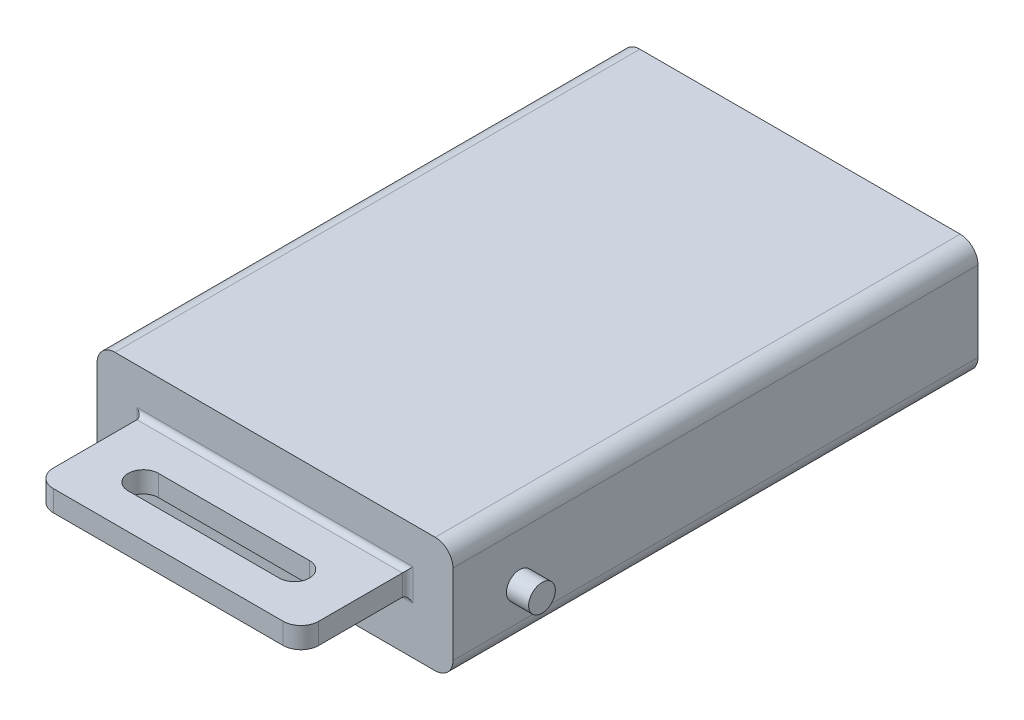
ISO-10303-21;
HEADER;
FILE_DESCRIPTION(('STEP AP214'),'2;1');
FILE_NAME('part.step','',(''),(''),'','','');
FILE_SCHEMA(('AUTOMOTIVE_DESIGN { 1 0 10303 214 1 1 1 1 }'));
ENDSEC;
DATA;
#1=APPLICATION_CONTEXT('core data for automotive mechanical design processes');
#2=APPLICATION_PROTOCOL_DEFINITION('international standard','automotive_design',2000,#1);
#3=PRODUCT_CONTEXT('',#1,'mechanical');
#4=PRODUCT('Part','Part','',(#3));
#5=PRODUCT_RELATED_PRODUCT_CATEGORY('part','',(#4));
#6=PRODUCT_DEFINITION_FORMATION('','',#4);
#7=PRODUCT_DEFINITION_CONTEXT('part definition',#1,'design');
#8=PRODUCT_DEFINITION('design','',#6,#7);
#9=PRODUCT_DEFINITION_SHAPE('','',#8);
#10=(LENGTH_UNIT() NAMED_UNIT(*) SI_UNIT(.MILLI.,.METRE.));
#11=(NAMED_UNIT(*) PLANE_ANGLE_UNIT() SI_UNIT($,.RADIAN.));
#12=(NAMED_UNIT(*) SI_UNIT($,.STERADIAN.) SOLID_ANGLE_UNIT());
#13=UNCERTAINTY_MEASURE_WITH_UNIT(LENGTH_MEASURE(1.E-05),#10,'distance_accuracy_value','');
#14=(GEOMETRIC_REPRESENTATION_CONTEXT(3) GLOBAL_UNCERTAINTY_ASSIGNED_CONTEXT((#13)) GLOBAL_UNIT_ASSIGNED_CONTEXT((#10,
#11,#12)) REPRESENTATION_CONTEXT('',''));
#15=CARTESIAN_POINT('',(0.,0.,0.));
#16=DIRECTION('',(0.,0.,1.));
#17=DIRECTION('',(1.,0.,0.));
#18=AXIS2_PLACEMENT_3D('',#15,#16,#17);
#19=CARTESIAN_POINT('',(2.53999999999999,13.97,0.));
#20=DIRECTION('',(0.,0.,1.));
#21=DIRECTION('',(1.,0.,0.));
#22=AXIS2_PLACEMENT_3D('',#19,#20,#21);
#23=PLANE('',#22);
#24=DIRECTION('',(1.,0.,0.));
#25=VECTOR('',#24,1.);
#26=CARTESIAN_POINT('',(2.53999999999999,6.75470203532326,0.));
#27=LINE('',#26,#25);
#28=CARTESIAN_POINT('',(45.1021824015215,6.75470203532326,0.));
#29=VERTEX_POINT('',#28);
#30=CARTESIAN_POINT('',(5.69781759847853,6.75470203532326,0.));
#31=VERTEX_POINT('',#30);
#32=EDGE_CURVE('E369',#29,#31,#27,.F.);
#33=ORIENTED_EDGE('',*,*,#32,.T.);
#34=DIRECTION('',(0.,-1.,0.));
#35=VECTOR('',#34,1.);
#36=CARTESIAN_POINT('',(5.69781759847853,13.97,0.));
#37=LINE('',#36,#35);
#38=CARTESIAN_POINT('',(5.69781759847853,11.2792979646767,0.));
#39=VERTEX_POINT('',#38);
#40=EDGE_CURVE('E371',#31,#39,#37,.F.);
#41=ORIENTED_EDGE('',*,*,#40,.T.);
#42=DIRECTION('',(-1.,0.,0.));
#43=VECTOR('',#42,1.);
#44=CARTESIAN_POINT('',(2.53999999999999,11.2792979646767,0.));
#45=LINE('',#44,#43);
#46=CARTESIAN_POINT('',(45.1021824015215,11.2792979646767,0.));
#47=VERTEX_POINT('',#46);
#48=EDGE_CURVE('E365',#39,#47,#45,.F.);
#49=ORIENTED_EDGE('',*,*,#48,.T.);
#50=DIRECTION('',(0.,1.,0.));
#51=VECTOR('',#50,1.);
#52=CARTESIAN_POINT('',(45.1021824015215,13.97,0.));
#53=LINE('',#52,#51);
#54=EDGE_CURVE('E367',#47,#29,#53,.F.);
#55=ORIENTED_EDGE('',*,*,#54,.T.);
#56=EDGE_LOOP('',(#33,#41,#49,#55));
#57=FACE_BOUND('',#56,.T.);
#58=CARTESIAN_POINT('',(2.53999999999999,13.97,0.));
#59=DIRECTION('',(0.,0.,1.));
#60=DIRECTION('',(1.,0.,0.));
#61=AXIS2_PLACEMENT_3D('',#58,#59,#60);
#62=CIRCLE('',#61,2.54);
#63=CARTESIAN_POINT('',(2.54000000000001,16.51,0.));
#64=VERTEX_POINT('',#63);
#65=CARTESIAN_POINT('',(0.,13.97,0.));
#66=VERTEX_POINT('',#65);
#67=EDGE_CURVE('E277',#64,#66,#62,.T.);
#68=ORIENTED_EDGE('',*,*,#67,.T.);
#69=DIRECTION('',(0.,-1.,0.));
#70=VECTOR('',#69,1.);
#71=CARTESIAN_POINT('',(0.,2.54000000000002,0.));
#72=LINE('',#71,#70);
#73=CARTESIAN_POINT('',(0.,2.54000000000002,0.));
#74=VERTEX_POINT('',#73);
#75=EDGE_CURVE('E306',#66,#74,#72,.T.);
#76=ORIENTED_EDGE('',*,*,#75,.T.);
#77=CARTESIAN_POINT('',(2.54,2.54,0.));
#78=DIRECTION('',(0.,0.,1.));
#79=DIRECTION('',(1.,0.,0.));
#80=AXIS2_PLACEMENT_3D('',#77,#78,#79);
#81=CIRCLE('',#80,2.54);
#82=CARTESIAN_POINT('',(2.54000000000002,0.,0.));
#83=VERTEX_POINT('',#82);
#84=EDGE_CURVE('E309',#74,#83,#81,.T.);
#85=ORIENTED_EDGE('',*,*,#84,.T.);
#86=DIRECTION('',(1.,0.,0.));
#87=VECTOR('',#86,1.);
#88=CARTESIAN_POINT('',(2.54000000000002,0.,0.));
#89=LINE('',#88,#87);
#90=CARTESIAN_POINT('',(48.26,0.,0.));
#91=VERTEX_POINT('',#90);
#92=EDGE_CURVE('E312',#83,#91,#89,.T.);
#93=ORIENTED_EDGE('',*,*,#92,.T.);
#94=CARTESIAN_POINT('',(48.26,2.54,0.));
#95=DIRECTION('',(0.,0.,1.));
#96=DIRECTION('',(-1.,0.,0.));
#97=AXIS2_PLACEMENT_3D('',#94,#95,#96);
#98=CIRCLE('',#97,2.54);
#99=CARTESIAN_POINT('',(50.8,2.54000000000002,0.));
#100=VERTEX_POINT('',#99);
#101=EDGE_CURVE('E315',#91,#100,#98,.T.);
#102=ORIENTED_EDGE('',*,*,#101,.T.);
#103=DIRECTION('',(0.,1.,0.));
#104=VECTOR('',#103,1.);
#105=CARTESIAN_POINT('',(50.8,2.54000000000002,0.));
#106=LINE('',#105,#104);
#107=CARTESIAN_POINT('',(50.8,13.97,0.));
#108=VERTEX_POINT('',#107);
#109=EDGE_CURVE('E318',#100,#108,#106,.T.);
#110=ORIENTED_EDGE('',*,*,#109,.T.);
#111=CARTESIAN_POINT('',(48.26,13.97,0.));
#112=DIRECTION('',(0.,0.,1.));
#113=DIRECTION('',(1.,0.,0.));
#114=AXIS2_PLACEMENT_3D('',#111,#112,#113);
#115=CIRCLE('',#114,2.54);
#116=CARTESIAN_POINT('',(48.26,16.51,0.));
#117=VERTEX_POINT('',#116);
#118=EDGE_CURVE('E321',#108,#117,#115,.T.);
#119=ORIENTED_EDGE('',*,*,#118,.T.);
#120=DIRECTION('',(-1.,0.,0.));
#121=VECTOR('',#120,1.);
#122=CARTESIAN_POINT('',(2.54000000000001,16.51,0.));
#123=LINE('',#122,#121);
#124=EDGE_CURVE('E282',#117,#64,#123,.T.);
#125=ORIENTED_EDGE('',*,*,#124,.T.);
#126=EDGE_LOOP('',(#68,#76,#85,#93,#102,#110,#119,#125));
#127=FACE_BOUND('',#126,.T.);
#128=ADVANCED_FACE('F30',(#57,#127),#23,.T.);
#129=CARTESIAN_POINT('',(50.8,2.54000000000002,-74.93));
#130=DIRECTION('',(1.,0.,0.));
#131=DIRECTION('',(0.,1.,0.));
#132=AXIS2_PLACEMENT_3D('',#129,#130,#131);
#133=PLANE('',#132);
#134=ORIENTED_EDGE('',*,*,#109,.F.);
#135=DIRECTION('',(0.,0.,1.));
#136=VECTOR('',#135,1.);
#137=CARTESIAN_POINT('',(50.8,2.54000000000002,-74.93));
#138=LINE('',#137,#136);
#139=CARTESIAN_POINT('',(50.8,2.54000000000002,-74.93));
#140=VERTEX_POINT('',#139);
#141=EDGE_CURVE('E333',#140,#100,#138,.T.);
#142=ORIENTED_EDGE('',*,*,#141,.F.);
#143=DIRECTION('',(0.,1.,0.));
#144=VECTOR('',#143,1.);
#145=CARTESIAN_POINT('',(50.8,2.54000000000002,-74.93));
#146=LINE('',#145,#144);
#147=CARTESIAN_POINT('',(50.8,13.97,-74.93));
#148=VERTEX_POINT('',#147);
#149=EDGE_CURVE('E294',#140,#148,#146,.T.);
#150=ORIENTED_EDGE('',*,*,#149,.T.);
#151=DIRECTION('',(0.,0.,1.));
#152=VECTOR('',#151,1.);
#153=CARTESIAN_POINT('',(50.8,13.97,-74.93));
#154=LINE('',#153,#152);
#155=EDGE_CURVE('E331',#148,#108,#154,.T.);
#156=ORIENTED_EDGE('',*,*,#155,.T.);
#157=EDGE_LOOP('',(#134,#142,#150,#156));
#158=FACE_BOUND('',#157,.T.);
#159=CARTESIAN_POINT('',(50.8,7.112,-9.525));
#160=DIRECTION('',(1.,0.,0.));
#161=DIRECTION('',(0.,0.,-1.));
#162=AXIS2_PLACEMENT_3D('',#159,#160,#161);
#163=CIRCLE('',#162,1.905);
#164=CARTESIAN_POINT('',(50.8,7.112,-11.43));
#165=VERTEX_POINT('',#164);
#166=EDGE_CURVE('E268',#165,#165,#163,.T.);
#167=ORIENTED_EDGE('',*,*,#166,.F.);
#168=EDGE_LOOP('',(#167));
#169=FACE_BOUND('',#168,.T.);
#170=ADVANCED_FACE('F427',(#158,#169),#133,.T.);
#171=CARTESIAN_POINT('',(2.53999999999999,13.97,-74.93));
#172=DIRECTION('',(0.,0.,1.));
#173=DIRECTION('',(1.,0.,0.));
#174=AXIS2_PLACEMENT_3D('',#171,#172,#173);
#175=CYLINDRICAL_SURFACE('',#174,2.54);
#176=ORIENTED_EDGE('',*,*,#67,.F.);
#177=DIRECTION('',(0.,0.,1.));
#178=VECTOR('',#177,1.);
#179=CARTESIAN_POINT('',(2.54000000000001,16.51,-74.93));
#180=LINE('',#179,#178);
#181=CARTESIAN_POINT('',(2.54000000000001,16.51,-74.93));
#182=VERTEX_POINT('',#181);
#183=EDGE_CURVE('E326',#182,#64,#180,.T.);
#184=ORIENTED_EDGE('',*,*,#183,.F.);
#185=CARTESIAN_POINT('',(2.53999999999999,13.97,-74.93));
#186=DIRECTION('',(0.,0.,1.));
#187=DIRECTION('',(1.,0.,0.));
#188=AXIS2_PLACEMENT_3D('',#185,#186,#187);
#189=CIRCLE('',#188,2.54);
#190=CARTESIAN_POINT('',(0.,13.97,-74.93));
#191=VERTEX_POINT('',#190);
#192=EDGE_CURVE('E278',#182,#191,#189,.T.);
#193=ORIENTED_EDGE('',*,*,#192,.T.);
#194=DIRECTION('',(0.,0.,1.));
#195=VECTOR('',#194,1.);
#196=CARTESIAN_POINT('',(0.,13.97,-74.93));
#197=LINE('',#196,#195);
#198=EDGE_CURVE('E303',#191,#66,#197,.T.);
#199=ORIENTED_EDGE('',*,*,#198,.T.);
#200=EDGE_LOOP('',(#176,#184,#193,#199));
#201=FACE_BOUND('',#200,.T.);
#202=ADVANCED_FACE('F433',(#201),#175,.T.);
#203=CARTESIAN_POINT('',(2.54000000000001,16.51,-74.93));
#204=DIRECTION('',(0.,1.,0.));
#205=DIRECTION('',(0.,0.,1.));
#206=AXIS2_PLACEMENT_3D('',#203,#204,#205);
#207=PLANE('',#206);
#208=ORIENTED_EDGE('',*,*,#124,.F.);
#209=DIRECTION('',(0.,0.,1.));
#210=VECTOR('',#209,1.);
#211=CARTESIAN_POINT('',(48.26,16.51,-74.93));
#212=LINE('',#211,#210);
#213=CARTESIAN_POINT('',(48.26,16.51,-74.93));
#214=VERTEX_POINT('',#213);
#215=EDGE_CURVE('E329',#214,#117,#212,.T.);
#216=ORIENTED_EDGE('',*,*,#215,.F.);
#217=DIRECTION('',(-1.,0.,0.));
#218=VECTOR('',#217,1.);
#219=CARTESIAN_POINT('',(2.54000000000001,16.51,-74.93));
#220=LINE('',#219,#218);
#221=EDGE_CURVE('E300',#214,#182,#220,.T.);
#222=ORIENTED_EDGE('',*,*,#221,.T.);
#223=ORIENTED_EDGE('',*,*,#183,.T.);
#224=EDGE_LOOP('',(#208,#216,#222,#223));
#225=FACE_BOUND('',#224,.T.);
#226=ADVANCED_FACE('F441',(#225),#207,.T.);
#227=CARTESIAN_POINT('',(48.26,13.97,-74.93));
#228=DIRECTION('',(0.,0.,1.));
#229=DIRECTION('',(1.,0.,0.));
#230=AXIS2_PLACEMENT_3D('',#227,#228,#229);
#231=CYLINDRICAL_SURFACE('',#230,2.54);
#232=ORIENTED_EDGE('',*,*,#118,.F.);
#233=ORIENTED_EDGE('',*,*,#155,.F.);
#234=CARTESIAN_POINT('',(48.26,13.97,-74.93));
#235=DIRECTION('',(0.,0.,1.));
#236=DIRECTION('',(1.,0.,0.));
#237=AXIS2_PLACEMENT_3D('',#234,#235,#236);
#238=CIRCLE('',#237,2.54);
#239=EDGE_CURVE('E297',#148,#214,#238,.T.);
#240=ORIENTED_EDGE('',*,*,#239,.T.);
#241=ORIENTED_EDGE('',*,*,#215,.T.);
#242=EDGE_LOOP('',(#232,#233,#240,#241));
#243=FACE_BOUND('',#242,.T.);
#244=ADVANCED_FACE('F444',(#243),#231,.T.);
#245=CARTESIAN_POINT('',(48.26,2.54,-74.93));
#246=DIRECTION('',(0.,0.,1.));
#247=DIRECTION('',(1.,0.,0.));
#248=AXIS2_PLACEMENT_3D('',#245,#246,#247);
#249=CYLINDRICAL_SURFACE('',#248,2.54);
#250=ORIENTED_EDGE('',*,*,#101,.F.);
#251=DIRECTION('',(0.,0.,1.));
#252=VECTOR('',#251,1.);
#253=CARTESIAN_POINT('',(48.26,0.,-74.93));
#254=LINE('',#253,#252);
#255=CARTESIAN_POINT('',(48.26,0.,-74.93));
#256=VERTEX_POINT('',#255);
#257=EDGE_CURVE('E335',#256,#91,#254,.T.);
#258=ORIENTED_EDGE('',*,*,#257,.F.);
#259=CARTESIAN_POINT('',(48.26,2.54,-74.93));
#260=DIRECTION('',(0.,0.,1.));
#261=DIRECTION('',(-1.,0.,0.));
#262=AXIS2_PLACEMENT_3D('',#259,#260,#261);
#263=CIRCLE('',#262,2.54);
#264=EDGE_CURVE('E291',#256,#140,#263,.T.);
#265=ORIENTED_EDGE('',*,*,#264,.T.);
#266=ORIENTED_EDGE('',*,*,#141,.T.);
#267=EDGE_LOOP('',(#250,#258,#265,#266));
#268=FACE_BOUND('',#267,.T.);
#269=ADVANCED_FACE('F447',(#268),#249,.T.);
#270=CARTESIAN_POINT('',(2.54000000000002,0.,-74.93));
#271=DIRECTION('',(0.,-1.,0.));
#272=DIRECTION('',(0.,0.,-1.));
#273=AXIS2_PLACEMENT_3D('',#270,#271,#272);
#274=PLANE('',#273);
#275=ORIENTED_EDGE('',*,*,#92,.F.);
#276=DIRECTION('',(0.,0.,1.));
#277=VECTOR('',#276,1.);
#278=CARTESIAN_POINT('',(2.54000000000002,0.,-74.93));
#279=LINE('',#278,#277);
#280=CARTESIAN_POINT('',(2.54000000000002,0.,-74.93));
#281=VERTEX_POINT('',#280);
#282=EDGE_CURVE('E337',#281,#83,#279,.T.);
#283=ORIENTED_EDGE('',*,*,#282,.F.);
#284=DIRECTION('',(1.,0.,0.));
#285=VECTOR('',#284,1.);
#286=CARTESIAN_POINT('',(2.54000000000002,0.,-74.93));
#287=LINE('',#286,#285);
#288=EDGE_CURVE('E288',#281,#256,#287,.T.);
#289=ORIENTED_EDGE('',*,*,#288,.T.);
#290=ORIENTED_EDGE('',*,*,#257,.T.);
#291=EDGE_LOOP('',(#275,#283,#289,#290));
#292=FACE_BOUND('',#291,.T.);
#293=ADVANCED_FACE('F452',(#292),#274,.T.);
#294=CARTESIAN_POINT('',(2.54,2.54,-74.93));
#295=DIRECTION('',(0.,0.,1.));
#296=DIRECTION('',(1.,0.,0.));
#297=AXIS2_PLACEMENT_3D('',#294,#295,#296);
#298=CYLINDRICAL_SURFACE('',#297,2.54);
#299=ORIENTED_EDGE('',*,*,#84,.F.);
#300=DIRECTION('',(0.,0.,1.));
#301=VECTOR('',#300,1.);
#302=CARTESIAN_POINT('',(0.,2.54000000000002,-74.93));
#303=LINE('',#302,#301);
#304=CARTESIAN_POINT('',(0.,2.54000000000002,-74.93));
#305=VERTEX_POINT('',#304);
#306=EDGE_CURVE('E339',#305,#74,#303,.T.);
#307=ORIENTED_EDGE('',*,*,#306,.F.);
#308=CARTESIAN_POINT('',(2.54,2.54,-74.93));
#309=DIRECTION('',(0.,0.,1.));
#310=DIRECTION('',(1.,0.,0.));
#311=AXIS2_PLACEMENT_3D('',#308,#309,#310);
#312=CIRCLE('',#311,2.54);
#313=EDGE_CURVE('E285',#305,#281,#312,.T.);
#314=ORIENTED_EDGE('',*,*,#313,.T.);
#315=ORIENTED_EDGE('',*,*,#282,.T.);
#316=EDGE_LOOP('',(#299,#307,#314,#315));
#317=FACE_BOUND('',#316,.T.);
#318=ADVANCED_FACE('F456',(#317),#298,.T.);
#319=CARTESIAN_POINT('',(0.,2.54000000000002,-74.93));
#320=DIRECTION('',(-1.,0.,0.));
#321=DIRECTION('',(0.,-1.,0.));
#322=AXIS2_PLACEMENT_3D('',#319,#320,#321);
#323=PLANE('',#322);
#324=CARTESIAN_POINT('',(0.,7.112,-9.525));
#325=DIRECTION('',(-1.,0.,0.));
#326=DIRECTION('',(0.,-1.,0.));
#327=AXIS2_PLACEMENT_3D('',#324,#325,#326);
#328=CIRCLE('',#327,1.905);
#329=CARTESIAN_POINT('',(0.,5.207,-9.525));
#330=VERTEX_POINT('',#329);
#331=EDGE_CURVE('E328',#330,#330,#328,.T.);
#332=ORIENTED_EDGE('',*,*,#331,.F.);
#333=EDGE_LOOP('',(#332));
#334=FACE_BOUND('',#333,.T.);
#335=ORIENTED_EDGE('',*,*,#75,.F.);
#336=ORIENTED_EDGE('',*,*,#198,.F.);
#337=DIRECTION('',(0.,-1.,0.));
#338=VECTOR('',#337,1.);
#339=CARTESIAN_POINT('',(0.,2.54000000000002,-74.93));
#340=LINE('',#339,#338);
#341=EDGE_CURVE('E281',#191,#305,#340,.T.);
#342=ORIENTED_EDGE('',*,*,#341,.T.);
#343=ORIENTED_EDGE('',*,*,#306,.T.);
#344=EDGE_LOOP('',(#335,#336,#342,#343));
#345=FACE_BOUND('',#344,.T.);
#346=ADVANCED_FACE('F460',(#334,#345),#323,.T.);
#347=CARTESIAN_POINT('',(2.53999999999999,13.97,-74.93));
#348=DIRECTION('',(0.,0.,1.));
#349=DIRECTION('',(1.,0.,0.));
#350=AXIS2_PLACEMENT_3D('',#347,#348,#349);
#351=PLANE('',#350);
#352=DIRECTION('',(1.,0.,0.));
#353=VECTOR('',#352,1.);
#354=CARTESIAN_POINT('',(45.1920646684565,10.0155566849987,-74.93));
#355=LINE('',#354,#353);
#356=CARTESIAN_POINT('',(5.60793533154354,10.0155566849987,-74.93));
#357=VERTEX_POINT('',#356);
#358=CARTESIAN_POINT('',(45.1920646684565,10.0155566849987,-74.93));
#359=VERTEX_POINT('',#358);
#360=EDGE_CURVE('E221',#357,#359,#355,.T.);
#361=ORIENTED_EDGE('',*,*,#360,.F.);
#362=DIRECTION('',(0.,1.,0.));
#363=VECTOR('',#362,1.);
#364=CARTESIAN_POINT('',(5.60793533154354,10.0155566849987,-74.93));
#365=LINE('',#364,#363);
#366=CARTESIAN_POINT('',(5.60793533154354,6.49444331500132,-74.93));
#367=VERTEX_POINT('',#366);
#368=EDGE_CURVE('E45',#367,#357,#365,.T.);
#369=ORIENTED_EDGE('',*,*,#368,.F.);
#370=DIRECTION('',(-1.,0.,0.));
#371=VECTOR('',#370,1.);
#372=CARTESIAN_POINT('',(45.1920646684565,6.49444331500132,-74.93));
#373=LINE('',#372,#371);
#374=CARTESIAN_POINT('',(45.1920646684565,6.49444331500132,-74.93));
#375=VERTEX_POINT('',#374);
#376=EDGE_CURVE('E212',#375,#367,#373,.T.);
#377=ORIENTED_EDGE('',*,*,#376,.F.);
#378=DIRECTION('',(0.,-1.,0.));
#379=VECTOR('',#378,1.);
#380=CARTESIAN_POINT('',(45.1920646684565,10.0155566849987,-74.93));
#381=LINE('',#380,#379);
#382=EDGE_CURVE('E215',#359,#375,#381,.T.);
#383=ORIENTED_EDGE('',*,*,#382,.F.);
#384=EDGE_LOOP('',(#361,#369,#377,#383));
#385=FACE_BOUND('',#384,.T.);
#386=ORIENTED_EDGE('',*,*,#192,.F.);
#387=ORIENTED_EDGE('',*,*,#221,.F.);
#388=ORIENTED_EDGE('',*,*,#239,.F.);
#389=ORIENTED_EDGE('',*,*,#149,.F.);
#390=ORIENTED_EDGE('',*,*,#264,.F.);
#391=ORIENTED_EDGE('',*,*,#288,.F.);
#392=ORIENTED_EDGE('',*,*,#313,.F.);
#393=ORIENTED_EDGE('',*,*,#341,.F.);
#394=EDGE_LOOP('',(#386,#387,#388,#389,#390,#391,#392,#393));
#395=FACE_BOUND('',#394,.T.);
#396=ADVANCED_FACE('F439',(#385,#395),#351,.F.);
#397=CARTESIAN_POINT('',(-3.175,7.112,-9.525));
#398=DIRECTION('',(1.,0.,0.));
#399=DIRECTION('',(0.,0.,-1.));
#400=AXIS2_PLACEMENT_3D('',#397,#398,#399);
#401=CYLINDRICAL_SURFACE('',#400,1.905);
#402=CARTESIAN_POINT('',(-3.175,7.112,-9.525));
#403=DIRECTION('',(1.,0.,0.));
#404=DIRECTION('',(0.,0.,-1.));
#405=AXIS2_PLACEMENT_3D('',#402,#403,#404);
#406=CIRCLE('',#405,1.905);
#407=CARTESIAN_POINT('',(-3.175,7.112,-11.43));
#408=VERTEX_POINT('',#407);
#409=EDGE_CURVE('E272',#408,#408,#406,.T.);
#410=ORIENTED_EDGE('',*,*,#409,.T.);
#411=EDGE_LOOP('',(#410));
#412=FACE_BOUND('',#411,.T.);
#413=ORIENTED_EDGE('',*,*,#331,.T.);
#414=EDGE_LOOP('',(#413));
#415=FACE_BOUND('',#414,.T.);
#416=ADVANCED_FACE('F533',(#412,#415),#401,.T.);
#417=CARTESIAN_POINT('',(-3.175,7.112,-9.525));
#418=DIRECTION('',(1.,0.,0.));
#419=DIRECTION('',(0.,0.,-1.));
#420=AXIS2_PLACEMENT_3D('',#417,#418,#419);
#421=PLANE('',#420);
#422=ORIENTED_EDGE('',*,*,#409,.F.);
#423=EDGE_LOOP('',(#422));
#424=FACE_BOUND('',#423,.T.);
#425=ADVANCED_FACE('F530',(#424),#421,.F.);
#426=CARTESIAN_POINT('',(53.975,7.112,-9.525));
#427=DIRECTION('',(-1.,0.,0.));
#428=DIRECTION('',(0.,0.,1.));
#429=AXIS2_PLACEMENT_3D('',#426,#427,#428);
#430=CYLINDRICAL_SURFACE('',#429,1.905);
#431=CARTESIAN_POINT('',(53.975,7.112,-9.525));
#432=DIRECTION('',(1.,0.,0.));
#433=DIRECTION('',(0.,0.,-1.));
#434=AXIS2_PLACEMENT_3D('',#431,#432,#433);
#435=CIRCLE('',#434,1.905);
#436=CARTESIAN_POINT('',(53.975,7.112,-11.43));
#437=VERTEX_POINT('',#436);
#438=EDGE_CURVE('E269',#437,#437,#435,.T.);
#439=ORIENTED_EDGE('',*,*,#438,.F.);
#440=EDGE_LOOP('',(#439));
#441=FACE_BOUND('',#440,.T.);
#442=ORIENTED_EDGE('',*,*,#166,.T.);
#443=EDGE_LOOP('',(#442));
#444=FACE_BOUND('',#443,.T.);
#445=ADVANCED_FACE('F523',(#441,#444),#430,.T.);
#446=CARTESIAN_POINT('',(53.975,7.112,-9.525));
#447=DIRECTION('',(-1.,0.,0.));
#448=DIRECTION('',(0.,0.,-1.));
#449=AXIS2_PLACEMENT_3D('',#446,#447,#448);
#450=PLANE('',#449);
#451=ORIENTED_EDGE('',*,*,#438,.T.);
#452=EDGE_LOOP('',(#451));
#453=FACE_BOUND('',#452,.T.);
#454=ADVANCED_FACE('F516',(#453),#450,.F.);
#455=CARTESIAN_POINT('',(44.3401824015215,10.5172979646767,15.24));
#456=DIRECTION('',(-1.,0.,0.));
#457=DIRECTION('',(0.,0.,1.));
#458=AXIS2_PLACEMENT_3D('',#455,#456,#457);
#459=PLANE('',#458);
#460=DIRECTION('',(0.,0.,-1.));
#461=VECTOR('',#460,1.);
#462=CARTESIAN_POINT('',(44.3401824015215,7.51670203532326,15.24));
#463=LINE('',#462,#461);
#464=CARTESIAN_POINT('',(44.3401824015215,7.51670203532326,12.7));
#465=VERTEX_POINT('',#464);
#466=CARTESIAN_POINT('',(44.3401824015215,7.51670203532326,0.762000000000002));
#467=VERTEX_POINT('',#466);
#468=EDGE_CURVE('E256',#465,#467,#463,.T.);
#469=ORIENTED_EDGE('',*,*,#468,.T.);
#470=DIRECTION('',(0.,1.,0.));
#471=VECTOR('',#470,1.);
#472=CARTESIAN_POINT('',(44.3401824015215,10.5172979646767,0.762000000000001));
#473=LINE('',#472,#471);
#474=CARTESIAN_POINT('',(44.3401824015215,10.5172979646767,0.762000000000002));
#475=VERTEX_POINT('',#474);
#476=EDGE_CURVE('E376',#467,#475,#473,.T.);
#477=ORIENTED_EDGE('',*,*,#476,.T.);
#478=DIRECTION('',(0.,0.,-1.));
#479=VECTOR('',#478,1.);
#480=CARTESIAN_POINT('',(44.3401824015215,10.5172979646767,15.24));
#481=LINE('',#480,#479);
#482=CARTESIAN_POINT('',(44.3401824015215,10.5172979646767,12.7));
#483=VERTEX_POINT('',#482);
#484=EDGE_CURVE('E265',#483,#475,#481,.T.);
#485=ORIENTED_EDGE('',*,*,#484,.F.);
#486=DIRECTION('',(0.,1.,0.));
#487=VECTOR('',#486,1.);
#488=CARTESIAN_POINT('',(44.3401824015215,7.51670203532326,12.7));
#489=LINE('',#488,#487);
#490=EDGE_CURVE('E360',#483,#465,#489,.F.);
#491=ORIENTED_EDGE('',*,*,#490,.T.);
#492=EDGE_LOOP('',(#469,#477,#485,#491));
#493=FACE_BOUND('',#492,.T.);
#494=ADVANCED_FACE('F513',(#493),#459,.F.);
#495=CARTESIAN_POINT('',(6.45981759847853,10.5172979646767,15.24));
#496=DIRECTION('',(0.,-1.,0.));
#497=DIRECTION('',(0.,0.,-1.));
#498=AXIS2_PLACEMENT_3D('',#495,#496,#497);
#499=PLANE('',#498);
#500=DIRECTION('',(-1.,0.,0.));
#501=VECTOR('',#500,1.);
#502=CARTESIAN_POINT('',(36.179236435074,10.5172979646767,5.85665644532159));
#503=LINE('',#502,#501);
#504=CARTESIAN_POINT('',(36.179236435074,10.5172979646767,5.85665644532159));
#505=VERTEX_POINT('',#504);
#506=CARTESIAN_POINT('',(14.620763564926,10.5172979646767,5.85665644532159));
#507=VERTEX_POINT('',#506);
#508=EDGE_CURVE('E231',#505,#507,#503,.T.);
#509=ORIENTED_EDGE('',*,*,#508,.F.);
#510=CARTESIAN_POINT('',(36.179236435074,10.5172979646767,8.0201597269451));
#511=DIRECTION('',(0.,1.,0.));
#512=DIRECTION('',(0.,0.,1.));
#513=AXIS2_PLACEMENT_3D('',#510,#511,#512);
#514=CIRCLE('',#513,2.16350328162351);
#515=CARTESIAN_POINT('',(36.179236435074,10.5172979646767,10.1836630085686));
#516=VERTEX_POINT('',#515);
#517=EDGE_CURVE('E53',#516,#505,#514,.T.);
#518=ORIENTED_EDGE('',*,*,#517,.F.);
#519=DIRECTION('',(1.,0.,0.));
#520=VECTOR('',#519,1.);
#521=CARTESIAN_POINT('',(36.179236435074,10.5172979646767,10.1836630085686));
#522=LINE('',#521,#520);
#523=CARTESIAN_POINT('',(14.620763564926,10.5172979646767,10.1836630085686));
#524=VERTEX_POINT('',#523);
#525=EDGE_CURVE('E237',#524,#516,#522,.T.);
#526=ORIENTED_EDGE('',*,*,#525,.F.);
#527=CARTESIAN_POINT('',(14.620763564926,10.5172979646767,8.0201597269451));
#528=DIRECTION('',(0.,1.,0.));
#529=DIRECTION('',(0.,0.,1.));
#530=AXIS2_PLACEMENT_3D('',#527,#528,#529);
#531=CIRCLE('',#530,2.16350328162351);
#532=EDGE_CURVE('E234',#507,#524,#531,.T.);
#533=ORIENTED_EDGE('',*,*,#532,.F.);
#534=EDGE_LOOP('',(#509,#518,#526,#533));
#535=FACE_BOUND('',#534,.T.);
#536=ORIENTED_EDGE('',*,*,#484,.T.);
#537=DIRECTION('',(-1.,0.,0.));
#538=VECTOR('',#537,1.);
#539=CARTESIAN_POINT('',(6.45981759847853,10.5172979646767,0.762000000000001));
#540=LINE('',#539,#538);
#541=CARTESIAN_POINT('',(6.45981759847853,10.5172979646767,0.762000000000002));
#542=VERTEX_POINT('',#541);
#543=EDGE_CURVE('E378',#475,#542,#540,.T.);
#544=ORIENTED_EDGE('',*,*,#543,.T.);
#545=DIRECTION('',(0.,0.,-1.));
#546=VECTOR('',#545,1.);
#547=CARTESIAN_POINT('',(6.45981759847853,10.5172979646767,15.24));
#548=LINE('',#547,#546);
#549=CARTESIAN_POINT('',(6.45981759847853,10.5172979646767,12.7));
#550=VERTEX_POINT('',#549);
#551=EDGE_CURVE('E262',#550,#542,#548,.T.);
#552=ORIENTED_EDGE('',*,*,#551,.F.);
#553=CARTESIAN_POINT('',(8.99981759847853,10.5172979646767,12.7));
#554=DIRECTION('',(0.,-1.,0.));
#555=DIRECTION('',(0.,0.,-1.));
#556=AXIS2_PLACEMENT_3D('',#553,#554,#555);
#557=CIRCLE('',#556,2.54);
#558=CARTESIAN_POINT('',(8.99981759847853,10.5172979646767,15.24));
#559=VERTEX_POINT('',#558);
#560=EDGE_CURVE('E358',#550,#559,#557,.F.);
#561=ORIENTED_EDGE('',*,*,#560,.T.);
#562=DIRECTION('',(-1.,0.,0.));
#563=VECTOR('',#562,1.);
#564=CARTESIAN_POINT('',(6.45981759847853,10.5172979646767,15.24));
#565=LINE('',#564,#563);
#566=CARTESIAN_POINT('',(41.8001824015215,10.5172979646767,15.24));
#567=VERTEX_POINT('',#566);
#568=EDGE_CURVE('E249',#567,#559,#565,.T.);
#569=ORIENTED_EDGE('',*,*,#568,.F.);
#570=CARTESIAN_POINT('',(41.8001824015215,10.5172979646767,12.7));
#571=DIRECTION('',(0.,-1.,0.));
#572=DIRECTION('',(0.,0.,-1.));
#573=AXIS2_PLACEMENT_3D('',#570,#571,#572);
#574=CIRCLE('',#573,2.54);
#575=EDGE_CURVE('E356',#567,#483,#574,.F.);
#576=ORIENTED_EDGE('',*,*,#575,.T.);
#577=EDGE_LOOP('',(#536,#544,#552,#561,#569,#576));
#578=FACE_BOUND('',#577,.T.);
#579=ADVANCED_FACE('F408',(#535,#578),#499,.F.);
#580=CARTESIAN_POINT('',(6.45981759847853,10.5172979646767,15.24));
#581=DIRECTION('',(1.,0.,0.));
#582=DIRECTION('',(0.,0.,-1.));
#583=AXIS2_PLACEMENT_3D('',#580,#581,#582);
#584=PLANE('',#583);
#585=ORIENTED_EDGE('',*,*,#551,.T.);
#586=DIRECTION('',(0.,-1.,0.));
#587=VECTOR('',#586,1.);
#588=CARTESIAN_POINT('',(6.45981759847853,10.5172979646767,0.762000000000001));
#589=LINE('',#588,#587);
#590=CARTESIAN_POINT('',(6.45981759847853,7.51670203532326,0.762000000000002));
#591=VERTEX_POINT('',#590);
#592=EDGE_CURVE('E362',#542,#591,#589,.T.);
#593=ORIENTED_EDGE('',*,*,#592,.T.);
#594=DIRECTION('',(0.,0.,-1.));
#595=VECTOR('',#594,1.);
#596=CARTESIAN_POINT('',(6.45981759847853,7.51670203532326,15.24));
#597=LINE('',#596,#595);
#598=CARTESIAN_POINT('',(6.45981759847853,7.51670203532326,12.7));
#599=VERTEX_POINT('',#598);
#600=EDGE_CURVE('E259',#599,#591,#597,.T.);
#601=ORIENTED_EDGE('',*,*,#600,.F.);
#602=DIRECTION('',(0.,-1.,0.));
#603=VECTOR('',#602,1.);
#604=CARTESIAN_POINT('',(6.45981759847853,10.5172979646767,12.7));
#605=LINE('',#604,#603);
#606=EDGE_CURVE('E354',#599,#550,#605,.F.);
#607=ORIENTED_EDGE('',*,*,#606,.T.);
#608=EDGE_LOOP('',(#585,#593,#601,#607));
#609=FACE_BOUND('',#608,.T.);
#610=ADVANCED_FACE('F501',(#609),#584,.F.);
#611=CARTESIAN_POINT('',(6.45981759847853,7.51670203532326,15.24));
#612=DIRECTION('',(0.,1.,0.));
#613=DIRECTION('',(0.,0.,1.));
#614=AXIS2_PLACEMENT_3D('',#611,#612,#613);
#615=PLANE('',#614);
#616=DIRECTION('',(1.,0.,0.));
#617=VECTOR('',#616,1.);
#618=CARTESIAN_POINT('',(6.45981759847853,7.51670203532326,10.1836630085686));
#619=LINE('',#618,#617);
#620=CARTESIAN_POINT('',(14.620763564926,7.51670203532326,10.1836630085686));
#621=VERTEX_POINT('',#620);
#622=CARTESIAN_POINT('',(36.179236435074,7.51670203532326,10.1836630085686));
#623=VERTEX_POINT('',#622);
#624=EDGE_CURVE('E38',#621,#623,#619,.T.);
#625=ORIENTED_EDGE('',*,*,#624,.T.);
#626=CARTESIAN_POINT('',(36.179236435074,7.51670203532326,8.0201597269451));
#627=DIRECTION('',(0.,1.,0.));
#628=DIRECTION('',(0.,0.,1.));
#629=AXIS2_PLACEMENT_3D('',#626,#627,#628);
#630=CIRCLE('',#629,2.16350328162351);
#631=CARTESIAN_POINT('',(36.179236435074,7.51670203532326,5.85665644532159));
#632=VERTEX_POINT('',#631);
#633=EDGE_CURVE('E11',#623,#632,#630,.T.);
#634=ORIENTED_EDGE('',*,*,#633,.T.);
#635=DIRECTION('',(-1.,0.,0.));
#636=VECTOR('',#635,1.);
#637=CARTESIAN_POINT('',(6.45981759847853,7.51670203532326,5.85665644532159));
#638=LINE('',#637,#636);
#639=CARTESIAN_POINT('',(14.620763564926,7.51670203532326,5.85665644532159));
#640=VERTEX_POINT('',#639);
#641=EDGE_CURVE('E380',#632,#640,#638,.T.);
#642=ORIENTED_EDGE('',*,*,#641,.T.);
#643=CARTESIAN_POINT('',(14.620763564926,7.51670203532326,8.0201597269451));
#644=DIRECTION('',(0.,1.,0.));
#645=DIRECTION('',(0.,0.,1.));
#646=AXIS2_PLACEMENT_3D('',#643,#644,#645);
#647=CIRCLE('',#646,2.16350328162351);
#648=EDGE_CURVE('E391',#640,#621,#647,.T.);
#649=ORIENTED_EDGE('',*,*,#648,.T.);
#650=EDGE_LOOP('',(#625,#634,#642,#649));
#651=FACE_BOUND('',#650,.T.);
#652=ORIENTED_EDGE('',*,*,#600,.T.);
#653=DIRECTION('',(1.,0.,0.));
#654=VECTOR('',#653,1.);
#655=CARTESIAN_POINT('',(6.45981759847853,7.51670203532326,0.762000000000001));
#656=LINE('',#655,#654);
#657=EDGE_CURVE('E374',#591,#467,#656,.T.);
#658=ORIENTED_EDGE('',*,*,#657,.T.);
#659=ORIENTED_EDGE('',*,*,#468,.F.);
#660=CARTESIAN_POINT('',(41.8001824015215,7.51670203532326,12.7));
#661=DIRECTION('',(0.,1.,0.));
#662=DIRECTION('',(0.,0.,1.));
#663=AXIS2_PLACEMENT_3D('',#660,#661,#662);
#664=CIRCLE('',#663,2.54);
#665=CARTESIAN_POINT('',(41.8001824015215,7.51670203532326,15.24));
#666=VERTEX_POINT('',#665);
#667=EDGE_CURVE('E350',#465,#666,#664,.F.);
#668=ORIENTED_EDGE('',*,*,#667,.T.);
#669=DIRECTION('',(1.,0.,0.));
#670=VECTOR('',#669,1.);
#671=CARTESIAN_POINT('',(6.45981759847853,7.51670203532326,15.24));
#672=LINE('',#671,#670);
#673=CARTESIAN_POINT('',(8.99981759847853,7.51670203532326,15.24));
#674=VERTEX_POINT('',#673);
#675=EDGE_CURVE('E252',#674,#666,#672,.T.);
#676=ORIENTED_EDGE('',*,*,#675,.F.);
#677=CARTESIAN_POINT('',(8.99981759847853,7.51670203532326,12.7));
#678=DIRECTION('',(0.,1.,0.));
#679=DIRECTION('',(0.,0.,1.));
#680=AXIS2_PLACEMENT_3D('',#677,#678,#679);
#681=CIRCLE('',#680,2.54);
#682=EDGE_CURVE('E352',#674,#599,#681,.F.);
#683=ORIENTED_EDGE('',*,*,#682,.T.);
#684=EDGE_LOOP('',(#652,#658,#659,#668,#676,#683));
#685=FACE_BOUND('',#684,.T.);
#686=ADVANCED_FACE('F395',(#651,#685),#615,.F.);
#687=CARTESIAN_POINT('',(44.3401824015215,7.51670203532326,15.24));
#688=DIRECTION('',(0.,0.,1.));
#689=DIRECTION('',(1.,0.,0.));
#690=AXIS2_PLACEMENT_3D('',#687,#688,#689);
#691=PLANE('',#690);
#692=ORIENTED_EDGE('',*,*,#568,.T.);
#693=DIRECTION('',(0.,-1.,0.));
#694=VECTOR('',#693,1.);
#695=CARTESIAN_POINT('',(8.99981759847853,7.51670203532326,15.24));
#696=LINE('',#695,#694);
#697=EDGE_CURVE('E347',#559,#674,#696,.T.);
#698=ORIENTED_EDGE('',*,*,#697,.T.);
#699=ORIENTED_EDGE('',*,*,#675,.T.);
#700=DIRECTION('',(0.,1.,0.));
#701=VECTOR('',#700,1.);
#702=CARTESIAN_POINT('',(41.8001824015215,10.5172979646767,15.24));
#703=LINE('',#702,#701);
#704=EDGE_CURVE('E344',#666,#567,#703,.T.);
#705=ORIENTED_EDGE('',*,*,#704,.T.);
#706=EDGE_LOOP('',(#692,#698,#699,#705));
#707=FACE_BOUND('',#706,.T.);
#708=ADVANCED_FACE('F472',(#707),#691,.T.);
#709=CARTESIAN_POINT('',(8.99981759847853,7.51670203532326,12.7));
#710=DIRECTION('',(0.,1.,0.));
#711=DIRECTION('',(0.,0.,1.));
#712=AXIS2_PLACEMENT_3D('',#709,#710,#711);
#713=CYLINDRICAL_SURFACE('',#712,2.54);
#714=ORIENTED_EDGE('',*,*,#560,.F.);
#715=ORIENTED_EDGE('',*,*,#606,.F.);
#716=ORIENTED_EDGE('',*,*,#682,.F.);
#717=ORIENTED_EDGE('',*,*,#697,.F.);
#718=EDGE_LOOP('',(#714,#715,#716,#717));
#719=FACE_BOUND('',#718,.T.);
#720=ADVANCED_FACE('F468',(#719),#713,.T.);
#721=CARTESIAN_POINT('',(41.8001824015215,7.51670203532326,12.7));
#722=DIRECTION('',(0.,-1.,0.));
#723=DIRECTION('',(0.,0.,-1.));
#724=AXIS2_PLACEMENT_3D('',#721,#722,#723);
#725=CYLINDRICAL_SURFACE('',#724,2.54);
#726=ORIENTED_EDGE('',*,*,#667,.F.);
#727=ORIENTED_EDGE('',*,*,#490,.F.);
#728=ORIENTED_EDGE('',*,*,#575,.F.);
#729=ORIENTED_EDGE('',*,*,#704,.F.);
#730=EDGE_LOOP('',(#726,#727,#728,#729));
#731=FACE_BOUND('',#730,.T.);
#732=ADVANCED_FACE('F471',(#731),#725,.T.);
#733=CARTESIAN_POINT('',(45.1021824015215,10.5172979646767,0.762000000000001));
#734=DIRECTION('',(0.,1.,0.));
#735=DIRECTION('',(0.,0.,1.));
#736=AXIS2_PLACEMENT_3D('',#733,#734,#735);
#737=CYLINDRICAL_SURFACE('',#736,0.762);
#738=CARTESIAN_POINT('',(45.1021824015215,6.75470203532326,0.762000000000001));
#739=DIRECTION('',(0.707106781186547,0.707106781186547,0.));
#740=DIRECTION('',(-0.707106781186547,0.707106781186547,0.));
#741=AXIS2_PLACEMENT_3D('',#738,#739,#740);
#742=ELLIPSE('',#741,1.0776307345283,0.762);
#743=EDGE_CURVE('E384',#29,#467,#742,.T.);
#744=ORIENTED_EDGE('',*,*,#743,.F.);
#745=ORIENTED_EDGE('',*,*,#54,.F.);
#746=CARTESIAN_POINT('',(45.1021824015215,11.2792979646767,0.762000000000001));
#747=DIRECTION('',(-0.707106781186547,0.707106781186547,0.));
#748=DIRECTION('',(-0.707106781186547,-0.707106781186547,0.));
#749=AXIS2_PLACEMENT_3D('',#746,#747,#748);
#750=ELLIPSE('',#749,1.0776307345283,0.762);
#751=EDGE_CURVE('E253',#475,#47,#750,.F.);
#752=ORIENTED_EDGE('',*,*,#751,.F.);
#753=ORIENTED_EDGE('',*,*,#476,.F.);
#754=EDGE_LOOP('',(#744,#745,#752,#753));
#755=FACE_BOUND('',#754,.T.);
#756=ADVANCED_FACE('F32',(#755),#737,.F.);
#757=CARTESIAN_POINT('',(6.45981759847853,11.2792979646767,0.762000000000001));
#758=DIRECTION('',(-1.,0.,0.));
#759=DIRECTION('',(0.,0.,1.));
#760=AXIS2_PLACEMENT_3D('',#757,#758,#759);
#761=CYLINDRICAL_SURFACE('',#760,0.762);
#762=ORIENTED_EDGE('',*,*,#751,.T.);
#763=ORIENTED_EDGE('',*,*,#48,.F.);
#764=CARTESIAN_POINT('',(5.69781759847853,11.2792979646767,0.762000000000001));
#765=DIRECTION('',(-0.707106781186547,-0.707106781186547,0.));
#766=DIRECTION('',(-0.707106781186547,0.707106781186547,0.));
#767=AXIS2_PLACEMENT_3D('',#764,#765,#766);
#768=ELLIPSE('',#767,1.0776307345283,0.762);
#769=EDGE_CURVE('E382',#542,#39,#768,.F.);
#770=ORIENTED_EDGE('',*,*,#769,.F.);
#771=ORIENTED_EDGE('',*,*,#543,.F.);
#772=EDGE_LOOP('',(#762,#763,#770,#771));
#773=FACE_BOUND('',#772,.T.);
#774=ADVANCED_FACE('F478',(#773),#761,.F.);
#775=CARTESIAN_POINT('',(6.45981759847853,6.75470203532326,0.762000000000001));
#776=DIRECTION('',(1.,0.,0.));
#777=DIRECTION('',(0.,0.,-1.));
#778=AXIS2_PLACEMENT_3D('',#775,#776,#777);
#779=CYLINDRICAL_SURFACE('',#778,0.762);
#780=ORIENTED_EDGE('',*,*,#743,.T.);
#781=ORIENTED_EDGE('',*,*,#657,.F.);
#782=CARTESIAN_POINT('',(5.69781759847853,6.75470203532326,0.762000000000001));
#783=DIRECTION('',(0.707106781186547,-0.707106781186547,0.));
#784=DIRECTION('',(0.707106781186547,0.707106781186547,0.));
#785=AXIS2_PLACEMENT_3D('',#782,#783,#784);
#786=ELLIPSE('',#785,1.0776307345283,0.762);
#787=EDGE_CURVE('E243',#31,#591,#786,.T.);
#788=ORIENTED_EDGE('',*,*,#787,.F.);
#789=ORIENTED_EDGE('',*,*,#32,.F.);
#790=EDGE_LOOP('',(#780,#781,#788,#789));
#791=FACE_BOUND('',#790,.T.);
#792=ADVANCED_FACE('F421',(#791),#779,.F.);
#793=CARTESIAN_POINT('',(5.69781759847853,10.5172979646767,0.762000000000001));
#794=DIRECTION('',(0.,-1.,0.));
#795=DIRECTION('',(0.,0.,-1.));
#796=AXIS2_PLACEMENT_3D('',#793,#794,#795);
#797=CYLINDRICAL_SURFACE('',#796,0.762);
#798=ORIENTED_EDGE('',*,*,#769,.T.);
#799=ORIENTED_EDGE('',*,*,#40,.F.);
#800=ORIENTED_EDGE('',*,*,#787,.T.);
#801=ORIENTED_EDGE('',*,*,#592,.F.);
#802=EDGE_LOOP('',(#798,#799,#800,#801));
#803=FACE_BOUND('',#802,.T.);
#804=ADVANCED_FACE('F414',(#803),#797,.F.);
#805=CARTESIAN_POINT('',(36.179236435074,-7.26270203532326,8.0201597269451));
#806=DIRECTION('',(0.,1.,0.));
#807=DIRECTION('',(0.,0.,1.));
#808=AXIS2_PLACEMENT_3D('',#805,#806,#807);
#809=CYLINDRICAL_SURFACE('',#808,2.16350328162351);
#810=DIRECTION('',(0.,1.,0.));
#811=VECTOR('',#810,1.);
#812=CARTESIAN_POINT('',(36.179236435074,-7.26270203532326,10.1836630085686));
#813=LINE('',#812,#811);
#814=EDGE_CURVE('E241',#623,#516,#813,.T.);
#815=ORIENTED_EDGE('',*,*,#814,.T.);
#816=ORIENTED_EDGE('',*,*,#517,.T.);
#817=DIRECTION('',(0.,1.,0.));
#818=VECTOR('',#817,1.);
#819=CARTESIAN_POINT('',(36.179236435074,-7.26270203532326,5.85665644532159));
#820=LINE('',#819,#818);
#821=EDGE_CURVE('E240',#632,#505,#820,.T.);
#822=ORIENTED_EDGE('',*,*,#821,.F.);
#823=ORIENTED_EDGE('',*,*,#633,.F.);
#824=EDGE_LOOP('',(#815,#816,#822,#823));
#825=FACE_BOUND('',#824,.T.);
#826=ADVANCED_FACE('F412',(#825),#809,.F.);
#827=CARTESIAN_POINT('',(36.179236435074,-7.26270203532326,10.1836630085686));
#828=DIRECTION('',(0.,0.,1.));
#829=DIRECTION('',(1.,0.,0.));
#830=AXIS2_PLACEMENT_3D('',#827,#828,#829);
#831=PLANE('',#830);
#832=DIRECTION('',(0.,1.,0.));
#833=VECTOR('',#832,1.);
#834=CARTESIAN_POINT('',(14.620763564926,-7.26270203532326,10.1836630085686));
#835=LINE('',#834,#833);
#836=EDGE_CURVE('E244',#621,#524,#835,.T.);
#837=ORIENTED_EDGE('',*,*,#836,.T.);
#838=ORIENTED_EDGE('',*,*,#525,.T.);
#839=ORIENTED_EDGE('',*,*,#814,.F.);
#840=ORIENTED_EDGE('',*,*,#624,.F.);
#841=EDGE_LOOP('',(#837,#838,#839,#840));
#842=FACE_BOUND('',#841,.T.);
#843=ADVANCED_FACE('F401',(#842),#831,.F.);
#844=CARTESIAN_POINT('',(14.620763564926,-7.26270203532326,8.0201597269451));
#845=DIRECTION('',(0.,1.,0.));
#846=DIRECTION('',(0.,0.,1.));
#847=AXIS2_PLACEMENT_3D('',#844,#845,#846);
#848=CYLINDRICAL_SURFACE('',#847,2.16350328162351);
#849=DIRECTION('',(0.,1.,0.));
#850=VECTOR('',#849,1.);
#851=CARTESIAN_POINT('',(14.620763564926,-7.26270203532326,5.85665644532159));
#852=LINE('',#851,#850);
#853=EDGE_CURVE('E246',#640,#507,#852,.T.);
#854=ORIENTED_EDGE('',*,*,#853,.T.);
#855=ORIENTED_EDGE('',*,*,#532,.T.);
#856=ORIENTED_EDGE('',*,*,#836,.F.);
#857=ORIENTED_EDGE('',*,*,#648,.F.);
#858=EDGE_LOOP('',(#854,#855,#856,#857));
#859=FACE_BOUND('',#858,.T.);
#860=ADVANCED_FACE('F403',(#859),#848,.F.);
#861=CARTESIAN_POINT('',(36.179236435074,-7.26270203532326,5.85665644532159));
#862=DIRECTION('',(0.,0.,-1.));
#863=DIRECTION('',(-1.,0.,0.));
#864=AXIS2_PLACEMENT_3D('',#861,#862,#863);
#865=PLANE('',#864);
#866=ORIENTED_EDGE('',*,*,#821,.T.);
#867=ORIENTED_EDGE('',*,*,#508,.T.);
#868=ORIENTED_EDGE('',*,*,#853,.F.);
#869=ORIENTED_EDGE('',*,*,#641,.F.);
#870=EDGE_LOOP('',(#866,#867,#868,#869));
#871=FACE_BOUND('',#870,.T.);
#872=ADVANCED_FACE('F411',(#871),#865,.F.);
#873=CARTESIAN_POINT('',(5.60793533154354,10.0155566849987,-57.15));
#874=DIRECTION('',(-1.,0.,0.));
#875=DIRECTION('',(0.,0.,1.));
#876=AXIS2_PLACEMENT_3D('',#873,#874,#875);
#877=PLANE('',#876);
#878=ORIENTED_EDGE('',*,*,#368,.T.);
#879=DIRECTION('',(0.,0.,-1.));
#880=VECTOR('',#879,1.);
#881=CARTESIAN_POINT('',(5.60793533154354,10.0155566849987,-57.15));
#882=LINE('',#881,#880);
#883=CARTESIAN_POINT('',(5.60793533154354,10.0155566849987,-57.15));
#884=VERTEX_POINT('',#883);
#885=EDGE_CURVE('E190',#884,#357,#882,.T.);
#886=ORIENTED_EDGE('',*,*,#885,.F.);
#887=DIRECTION('',(0.,1.,0.));
#888=VECTOR('',#887,1.);
#889=CARTESIAN_POINT('',(5.60793533154354,10.0155566849987,-57.15));
#890=LINE('',#889,#888);
#891=CARTESIAN_POINT('',(5.60793533154354,6.49444331500132,-57.15));
#892=VERTEX_POINT('',#891);
#893=EDGE_CURVE('E194',#892,#884,#890,.T.);
#894=ORIENTED_EDGE('',*,*,#893,.F.);
#895=DIRECTION('',(0.,0.,-1.));
#896=VECTOR('',#895,1.);
#897=CARTESIAN_POINT('',(5.60793533154354,6.49444331500132,-57.15));
#898=LINE('',#897,#896);
#899=EDGE_CURVE('E225',#892,#367,#898,.T.);
#900=ORIENTED_EDGE('',*,*,#899,.T.);
#901=EDGE_LOOP('',(#878,#886,#894,#900));
#902=FACE_BOUND('',#901,.T.);
#903=ADVANCED_FACE('F192',(#902),#877,.F.);
#904=CARTESIAN_POINT('',(45.1920646684565,6.49444331500132,-57.15));
#905=DIRECTION('',(0.,-1.,0.));
#906=DIRECTION('',(0.,0.,-1.));
#907=AXIS2_PLACEMENT_3D('',#904,#905,#906);
#908=PLANE('',#907);
#909=ORIENTED_EDGE('',*,*,#376,.T.);
#910=ORIENTED_EDGE('',*,*,#899,.F.);
#911=DIRECTION('',(-1.,0.,0.));
#912=VECTOR('',#911,1.);
#913=CARTESIAN_POINT('',(45.1920646684565,6.49444331500132,-57.15));
#914=LINE('',#913,#912);
#915=CARTESIAN_POINT('',(45.1920646684565,6.49444331500132,-57.15));
#916=VERTEX_POINT('',#915);
#917=EDGE_CURVE('E200',#916,#892,#914,.T.);
#918=ORIENTED_EDGE('',*,*,#917,.F.);
#919=DIRECTION('',(0.,0.,-1.));
#920=VECTOR('',#919,1.);
#921=CARTESIAN_POINT('',(45.1920646684565,6.49444331500132,-57.15));
#922=LINE('',#921,#920);
#923=EDGE_CURVE('E227',#916,#375,#922,.T.);
#924=ORIENTED_EDGE('',*,*,#923,.T.);
#925=EDGE_LOOP('',(#909,#910,#918,#924));
#926=FACE_BOUND('',#925,.T.);
#927=ADVANCED_FACE('F572',(#926),#908,.F.);
#928=CARTESIAN_POINT('',(45.1920646684565,10.0155566849987,-57.15));
#929=DIRECTION('',(1.,0.,0.));
#930=DIRECTION('',(0.,0.,-1.));
#931=AXIS2_PLACEMENT_3D('',#928,#929,#930);
#932=PLANE('',#931);
#933=ORIENTED_EDGE('',*,*,#382,.T.);
#934=ORIENTED_EDGE('',*,*,#923,.F.);
#935=DIRECTION('',(0.,-1.,0.));
#936=VECTOR('',#935,1.);
#937=CARTESIAN_POINT('',(45.1920646684565,10.0155566849987,-57.15));
#938=LINE('',#937,#936);
#939=CARTESIAN_POINT('',(45.1920646684565,10.0155566849987,-57.15));
#940=VERTEX_POINT('',#939);
#941=EDGE_CURVE('E208',#940,#916,#938,.T.);
#942=ORIENTED_EDGE('',*,*,#941,.F.);
#943=DIRECTION('',(0.,0.,-1.));
#944=VECTOR('',#943,1.);
#945=CARTESIAN_POINT('',(45.1920646684565,10.0155566849987,-57.15));
#946=LINE('',#945,#944);
#947=EDGE_CURVE('E199',#940,#359,#946,.T.);
#948=ORIENTED_EDGE('',*,*,#947,.T.);
#949=EDGE_LOOP('',(#933,#934,#942,#948));
#950=FACE_BOUND('',#949,.T.);
#951=ADVANCED_FACE('F570',(#950),#932,.F.);
#952=CARTESIAN_POINT('',(45.1920646684565,10.0155566849987,-57.15));
#953=DIRECTION('',(0.,1.,0.));
#954=DIRECTION('',(0.,0.,1.));
#955=AXIS2_PLACEMENT_3D('',#952,#953,#954);
#956=PLANE('',#955);
#957=ORIENTED_EDGE('',*,*,#360,.T.);
#958=ORIENTED_EDGE('',*,*,#947,.F.);
#959=DIRECTION('',(1.,0.,0.));
#960=VECTOR('',#959,1.);
#961=CARTESIAN_POINT('',(45.1920646684565,10.0155566849987,-57.15));
#962=LINE('',#961,#960);
#963=EDGE_CURVE('E203',#884,#940,#962,.T.);
#964=ORIENTED_EDGE('',*,*,#963,.F.);
#965=ORIENTED_EDGE('',*,*,#885,.T.);
#966=EDGE_LOOP('',(#957,#958,#964,#965));
#967=FACE_BOUND('',#966,.T.);
#968=ADVANCED_FACE('F204',(#967),#956,.F.);
#969=CARTESIAN_POINT('',(5.60793533154354,6.49444331500132,-57.15));
#970=DIRECTION('',(0.,0.,-1.));
#971=DIRECTION('',(-1.,0.,0.));
#972=AXIS2_PLACEMENT_3D('',#969,#970,#971);
#973=PLANE('',#972);
#974=ORIENTED_EDGE('',*,*,#893,.T.);
#975=ORIENTED_EDGE('',*,*,#963,.T.);
#976=ORIENTED_EDGE('',*,*,#941,.T.);
#977=ORIENTED_EDGE('',*,*,#917,.T.);
#978=EDGE_LOOP('',(#974,#975,#976,#977));
#979=FACE_BOUND('',#978,.T.);
#980=ADVANCED_FACE('F210',(#979),#973,.T.);
#981=CLOSED_SHELL('',(#128,#170,#202,#226,#244,#269,#293,#318,#346,#396,#416,#425,#445,#454,
#494,#579,#610,#686,#708,#720,#732,#756,#774,#792,#804,#826,#843,#860,#872,#903,#927,#951,#968,#980));
#982=MANIFOLD_SOLID_BREP('B2',#981);
#983=ADVANCED_BREP_SHAPE_REPRESENTATION('',(#18,#982),#14);
#984=SHAPE_DEFINITION_REPRESENTATION(#9,#983);
ENDSEC;
END-ISO-10303-21;
